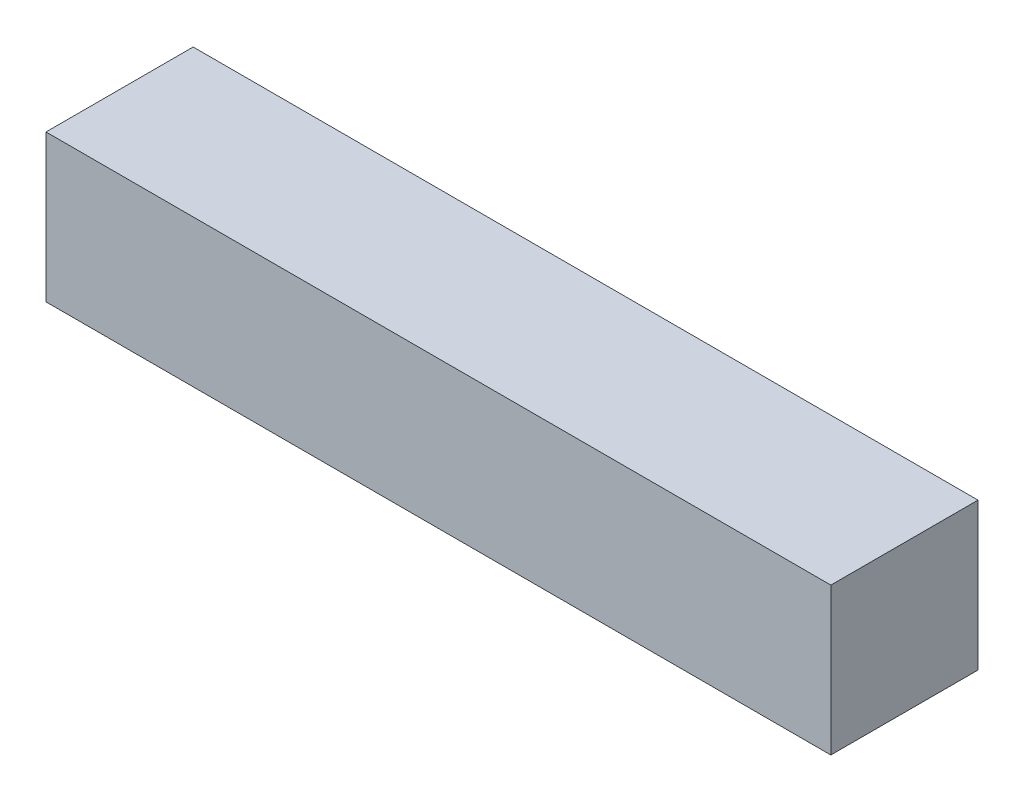
ISO-10303-21;
HEADER;
FILE_DESCRIPTION(('STEP AP214'),'2;1');
FILE_NAME('part.step','',(''),(''),'','','');
FILE_SCHEMA(('AUTOMOTIVE_DESIGN { 1 0 10303 214 1 1 1 1 }'));
ENDSEC;
DATA;
#1=APPLICATION_CONTEXT('core data for automotive mechanical design processes');
#2=APPLICATION_PROTOCOL_DEFINITION('international standard','automotive_design',2000,#1);
#3=PRODUCT_CONTEXT('',#1,'mechanical');
#4=PRODUCT('Part','Part','',(#3));
#5=PRODUCT_RELATED_PRODUCT_CATEGORY('part','',(#4));
#6=PRODUCT_DEFINITION_FORMATION('','',#4);
#7=PRODUCT_DEFINITION_CONTEXT('part definition',#1,'design');
#8=PRODUCT_DEFINITION('design','',#6,#7);
#9=PRODUCT_DEFINITION_SHAPE('','',#8);
#10=(LENGTH_UNIT() NAMED_UNIT(*) SI_UNIT(.MILLI.,.METRE.));
#11=(NAMED_UNIT(*) PLANE_ANGLE_UNIT() SI_UNIT($,.RADIAN.));
#12=(NAMED_UNIT(*) SI_UNIT($,.STERADIAN.) SOLID_ANGLE_UNIT());
#13=UNCERTAINTY_MEASURE_WITH_UNIT(LENGTH_MEASURE(1.E-05),#10,'distance_accuracy_value','');
#14=(GEOMETRIC_REPRESENTATION_CONTEXT(3) GLOBAL_UNCERTAINTY_ASSIGNED_CONTEXT((#13)) GLOBAL_UNIT_ASSIGNED_CONTEXT((#10,
#11,#12)) REPRESENTATION_CONTEXT('',''));
#15=CARTESIAN_POINT('',(0.,0.,0.));
#16=DIRECTION('',(0.,0.,1.));
#17=DIRECTION('',(1.,0.,0.));
#18=AXIS2_PLACEMENT_3D('',#15,#16,#17);
#19=CARTESIAN_POINT('',(-101.6,19.05,38.1));
#20=DIRECTION('',(1.,0.,0.));
#21=DIRECTION('',(0.,0.,-1.));
#22=AXIS2_PLACEMENT_3D('',#19,#20,#21);
#23=PLANE('',#22);
#24=DIRECTION('',(0.,-1.,0.));
#25=VECTOR('',#24,1.);
#26=CARTESIAN_POINT('',(-101.6,19.05,0.));
#27=LINE('',#26,#25);
#28=CARTESIAN_POINT('',(-101.6,19.05,0.));
#29=VERTEX_POINT('',#28);
#30=CARTESIAN_POINT('',(-101.6,-19.05,0.));
#31=VERTEX_POINT('',#30);
#32=EDGE_CURVE('E95',#29,#31,#27,.T.);
#33=ORIENTED_EDGE('',*,*,#32,.T.);
#34=DIRECTION('',(0.,0.,-1.));
#35=VECTOR('',#34,1.);
#36=CARTESIAN_POINT('',(-101.6,-19.05,38.1));
#37=LINE('',#36,#35);
#38=CARTESIAN_POINT('',(-101.6,-19.05,38.1));
#39=VERTEX_POINT('',#38);
#40=EDGE_CURVE('E11',#39,#31,#37,.T.);
#41=ORIENTED_EDGE('',*,*,#40,.F.);
#42=DIRECTION('',(0.,-1.,0.));
#43=VECTOR('',#42,1.);
#44=CARTESIAN_POINT('',(-101.6,19.05,38.1));
#45=LINE('',#44,#43);
#46=CARTESIAN_POINT('',(-101.6,19.05,38.1));
#47=VERTEX_POINT('',#46);
#48=EDGE_CURVE('E83',#47,#39,#45,.T.);
#49=ORIENTED_EDGE('',*,*,#48,.F.);
#50=DIRECTION('',(0.,0.,-1.));
#51=VECTOR('',#50,1.);
#52=CARTESIAN_POINT('',(-101.6,19.05,38.1));
#53=LINE('',#52,#51);
#54=EDGE_CURVE('E91',#47,#29,#53,.T.);
#55=ORIENTED_EDGE('',*,*,#54,.T.);
#56=EDGE_LOOP('',(#33,#41,#49,#55));
#57=FACE_BOUND('',#56,.T.);
#58=ADVANCED_FACE('F32',(#57),#23,.F.);
#59=CARTESIAN_POINT('',(-101.6,-19.05,38.1));
#60=DIRECTION('',(0.,1.,0.));
#61=DIRECTION('',(-1.,0.,0.));
#62=AXIS2_PLACEMENT_3D('',#59,#60,#61);
#63=PLANE('',#62);
#64=DIRECTION('',(1.,0.,0.));
#65=VECTOR('',#64,1.);
#66=CARTESIAN_POINT('',(-101.6,-19.05,0.));
#67=LINE('',#66,#65);
#68=CARTESIAN_POINT('',(101.6,-19.05,0.));
#69=VERTEX_POINT('',#68);
#70=EDGE_CURVE('E87',#31,#69,#67,.T.);
#71=ORIENTED_EDGE('',*,*,#70,.T.);
#72=DIRECTION('',(0.,0.,-1.));
#73=VECTOR('',#72,1.);
#74=CARTESIAN_POINT('',(101.6,-19.05,38.1));
#75=LINE('',#74,#73);
#76=CARTESIAN_POINT('',(101.6,-19.05,38.1));
#77=VERTEX_POINT('',#76);
#78=EDGE_CURVE('E40',#77,#69,#75,.T.);
#79=ORIENTED_EDGE('',*,*,#78,.F.);
#80=DIRECTION('',(1.,0.,0.));
#81=VECTOR('',#80,1.);
#82=CARTESIAN_POINT('',(-101.6,-19.05,38.1));
#83=LINE('',#82,#81);
#84=EDGE_CURVE('E78',#39,#77,#83,.T.);
#85=ORIENTED_EDGE('',*,*,#84,.F.);
#86=ORIENTED_EDGE('',*,*,#40,.T.);
#87=EDGE_LOOP('',(#71,#79,#85,#86));
#88=FACE_BOUND('',#87,.T.);
#89=ADVANCED_FACE('F86',(#88),#63,.F.);
#90=CARTESIAN_POINT('',(101.6,19.05,38.1));
#91=DIRECTION('',(-1.,0.,0.));
#92=DIRECTION('',(0.,0.,1.));
#93=AXIS2_PLACEMENT_3D('',#90,#91,#92);
#94=PLANE('',#93);
#95=DIRECTION('',(0.,1.,0.));
#96=VECTOR('',#95,1.);
#97=CARTESIAN_POINT('',(101.6,19.05,0.));
#98=LINE('',#97,#96);
#99=CARTESIAN_POINT('',(101.6,19.05,0.));
#100=VERTEX_POINT('',#99);
#101=EDGE_CURVE('E65',#69,#100,#98,.T.);
#102=ORIENTED_EDGE('',*,*,#101,.T.);
#103=DIRECTION('',(0.,0.,-1.));
#104=VECTOR('',#103,1.);
#105=CARTESIAN_POINT('',(101.6,19.05,38.1));
#106=LINE('',#105,#104);
#107=CARTESIAN_POINT('',(101.6,19.05,38.1));
#108=VERTEX_POINT('',#107);
#109=EDGE_CURVE('E88',#108,#100,#106,.T.);
#110=ORIENTED_EDGE('',*,*,#109,.F.);
#111=DIRECTION('',(0.,1.,0.));
#112=VECTOR('',#111,1.);
#113=CARTESIAN_POINT('',(101.6,19.05,38.1));
#114=LINE('',#113,#112);
#115=EDGE_CURVE('E81',#77,#108,#114,.T.);
#116=ORIENTED_EDGE('',*,*,#115,.F.);
#117=ORIENTED_EDGE('',*,*,#78,.T.);
#118=EDGE_LOOP('',(#102,#110,#116,#117));
#119=FACE_BOUND('',#118,.T.);
#120=ADVANCED_FACE('F89',(#119),#94,.F.);
#121=CARTESIAN_POINT('',(-101.6,19.05,38.1));
#122=DIRECTION('',(0.,-1.,0.));
#123=DIRECTION('',(1.,0.,0.));
#124=AXIS2_PLACEMENT_3D('',#121,#122,#123);
#125=PLANE('',#124);
#126=DIRECTION('',(-1.,0.,0.));
#127=VECTOR('',#126,1.);
#128=CARTESIAN_POINT('',(-101.6,19.05,0.));
#129=LINE('',#128,#127);
#130=EDGE_CURVE('E71',#100,#29,#129,.T.);
#131=ORIENTED_EDGE('',*,*,#130,.T.);
#132=ORIENTED_EDGE('',*,*,#54,.F.);
#133=DIRECTION('',(-1.,0.,0.));
#134=VECTOR('',#133,1.);
#135=CARTESIAN_POINT('',(-101.6,19.05,38.1));
#136=LINE('',#135,#134);
#137=EDGE_CURVE('E48',#108,#47,#136,.T.);
#138=ORIENTED_EDGE('',*,*,#137,.F.);
#139=ORIENTED_EDGE('',*,*,#109,.T.);
#140=EDGE_LOOP('',(#131,#132,#138,#139));
#141=FACE_BOUND('',#140,.T.);
#142=ADVANCED_FACE('F102',(#141),#125,.F.);
#143=CARTESIAN_POINT('',(0.,0.,38.1));
#144=DIRECTION('',(0.,0.,1.));
#145=DIRECTION('',(1.,0.,0.));
#146=AXIS2_PLACEMENT_3D('',#143,#144,#145);
#147=PLANE('',#146);
#148=ORIENTED_EDGE('',*,*,#48,.T.);
#149=ORIENTED_EDGE('',*,*,#84,.T.);
#150=ORIENTED_EDGE('',*,*,#115,.T.);
#151=ORIENTED_EDGE('',*,*,#137,.T.);
#152=EDGE_LOOP('',(#148,#149,#150,#151));
#153=FACE_BOUND('',#152,.T.);
#154=ADVANCED_FACE('F79',(#153),#147,.T.);
#155=CARTESIAN_POINT('',(0.,0.,0.));
#156=DIRECTION('',(0.,0.,1.));
#157=DIRECTION('',(1.,0.,0.));
#158=AXIS2_PLACEMENT_3D('',#155,#156,#157);
#159=PLANE('',#158);
#160=ORIENTED_EDGE('',*,*,#32,.F.);
#161=ORIENTED_EDGE('',*,*,#130,.F.);
#162=ORIENTED_EDGE('',*,*,#101,.F.);
#163=ORIENTED_EDGE('',*,*,#70,.F.);
#164=EDGE_LOOP('',(#160,#161,#162,#163));
#165=FACE_BOUND('',#164,.T.);
#166=ADVANCED_FACE('F105',(#165),#159,.F.);
#167=CLOSED_SHELL('',(#58,#89,#120,#142,#154,#166));
#168=MANIFOLD_SOLID_BREP('B2',#167);
#169=ADVANCED_BREP_SHAPE_REPRESENTATION('',(#18,#168),#14);
#170=SHAPE_DEFINITION_REPRESENTATION(#9,#169);
ENDSEC;
END-ISO-10303-21;
